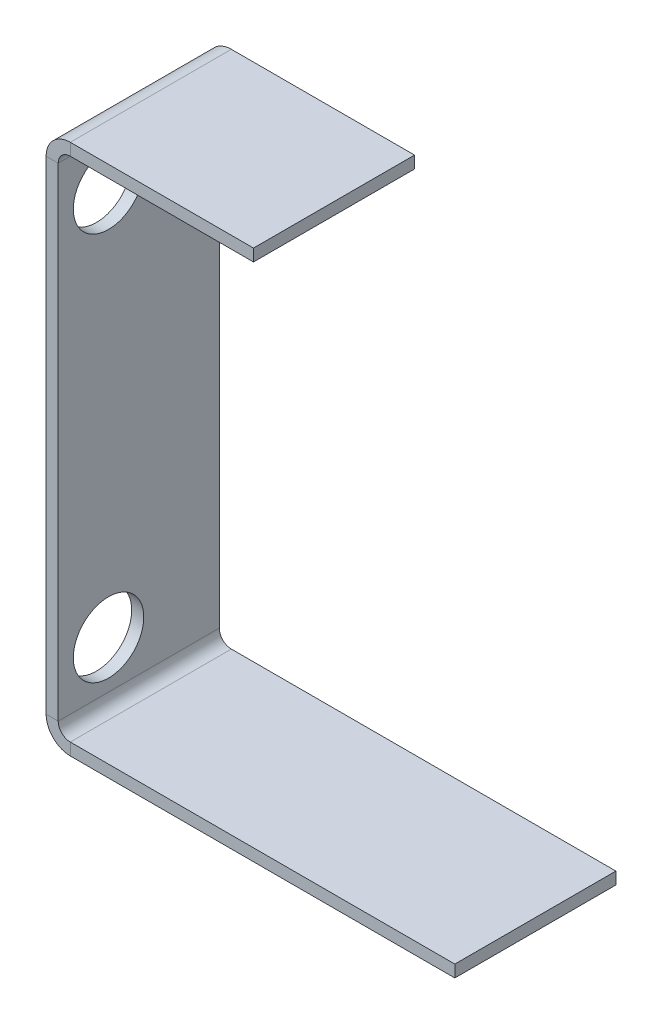
ISO-10303-21;
HEADER;
FILE_DESCRIPTION(('STEP AP214'),'2;1');
FILE_NAME('part.step','',(''),(''),'','','');
FILE_SCHEMA(('AUTOMOTIVE_DESIGN { 1 0 10303 214 1 1 1 1 }'));
ENDSEC;
DATA;
#1=APPLICATION_CONTEXT('core data for automotive mechanical design processes');
#2=APPLICATION_PROTOCOL_DEFINITION('international standard','automotive_design',2000,#1);
#3=PRODUCT_CONTEXT('',#1,'mechanical');
#4=PRODUCT('Part','Part','',(#3));
#5=PRODUCT_RELATED_PRODUCT_CATEGORY('part','',(#4));
#6=PRODUCT_DEFINITION_FORMATION('','',#4);
#7=PRODUCT_DEFINITION_CONTEXT('part definition',#1,'design');
#8=PRODUCT_DEFINITION('design','',#6,#7);
#9=PRODUCT_DEFINITION_SHAPE('','',#8);
#10=(LENGTH_UNIT() NAMED_UNIT(*) SI_UNIT(.MILLI.,.METRE.));
#11=(NAMED_UNIT(*) PLANE_ANGLE_UNIT() SI_UNIT($,.RADIAN.));
#12=(NAMED_UNIT(*) SI_UNIT($,.STERADIAN.) SOLID_ANGLE_UNIT());
#13=UNCERTAINTY_MEASURE_WITH_UNIT(LENGTH_MEASURE(1.E-05),#10,'distance_accuracy_value','');
#14=(GEOMETRIC_REPRESENTATION_CONTEXT(3) GLOBAL_UNCERTAINTY_ASSIGNED_CONTEXT((#13)) GLOBAL_UNIT_ASSIGNED_CONTEXT((#10,
#11,#12)) REPRESENTATION_CONTEXT('',''));
#15=CARTESIAN_POINT('',(0.,0.,0.));
#16=DIRECTION('',(0.,0.,1.));
#17=DIRECTION('',(1.,0.,0.));
#18=AXIS2_PLACEMENT_3D('',#15,#16,#17);
#19=CARTESIAN_POINT('',(0.,-6.,80.));
#20=DIRECTION('',(0.,0.,1.));
#21=DIRECTION('',(1.,0.,0.));
#22=AXIS2_PLACEMENT_3D('',#19,#20,#21);
#23=PLANE('',#22);
#24=DIRECTION('',(-1.,0.,0.));
#25=VECTOR('',#24,1.);
#26=CARTESIAN_POINT('',(0.,-6.,80.));
#27=LINE('',#26,#25);
#28=CARTESIAN_POINT('',(0.,-6.,80.));
#29=VERTEX_POINT('',#28);
#30=CARTESIAN_POINT('',(-6.,-6.,80.));
#31=VERTEX_POINT('',#30);
#32=EDGE_CURVE('E11',#29,#31,#27,.T.);
#33=ORIENTED_EDGE('',*,*,#32,.F.);
#34=CARTESIAN_POINT('',(6.,-6.,80.));
#35=DIRECTION('',(0.,0.,-1.));
#36=DIRECTION('',(-1.,0.,0.));
#37=AXIS2_PLACEMENT_3D('',#34,#35,#36);
#38=CIRCLE('',#37,6.);
#39=CARTESIAN_POINT('',(6.,0.,80.));
#40=VERTEX_POINT('',#39);
#41=EDGE_CURVE('E249',#40,#29,#38,.F.);
#42=ORIENTED_EDGE('',*,*,#41,.F.);
#43=DIRECTION('',(0.,-1.,0.));
#44=VECTOR('',#43,1.);
#45=CARTESIAN_POINT('',(5.99999999999999,6.,80.));
#46=LINE('',#45,#44);
#47=CARTESIAN_POINT('',(5.99999999999999,6.,80.));
#48=VERTEX_POINT('',#47);
#49=EDGE_CURVE('E46',#48,#40,#46,.T.);
#50=ORIENTED_EDGE('',*,*,#49,.F.);
#51=CARTESIAN_POINT('',(6.,-6.,80.));
#52=DIRECTION('',(0.,0.,1.));
#53=DIRECTION('',(1.,0.,0.));
#54=AXIS2_PLACEMENT_3D('',#51,#52,#53);
#55=CIRCLE('',#54,12.);
#56=EDGE_CURVE('E147',#48,#31,#55,.T.);
#57=ORIENTED_EDGE('',*,*,#56,.T.);
#58=EDGE_LOOP('',(#33,#42,#50,#57));
#59=FACE_BOUND('',#58,.T.);
#60=ADVANCED_FACE('F38',(#59),#23,.T.);
#61=CARTESIAN_POINT('',(5.99999999999999,6.,80.));
#62=DIRECTION('',(0.,0.,1.));
#63=DIRECTION('',(1.,0.,0.));
#64=AXIS2_PLACEMENT_3D('',#61,#62,#63);
#65=PLANE('',#64);
#66=DIRECTION('',(0.,-1.,0.));
#67=VECTOR('',#66,1.);
#68=CARTESIAN_POINT('',(0.,0.,80.));
#69=LINE('',#68,#67);
#70=CARTESIAN_POINT('',(0.,-246.,80.));
#71=VERTEX_POINT('',#70);
#72=EDGE_CURVE('E141',#29,#71,#69,.T.);
#73=ORIENTED_EDGE('',*,*,#72,.F.);
#74=ORIENTED_EDGE('',*,*,#32,.T.);
#75=DIRECTION('',(0.,-1.,0.));
#76=VECTOR('',#75,1.);
#77=CARTESIAN_POINT('',(-6.,0.,80.));
#78=LINE('',#77,#76);
#79=CARTESIAN_POINT('',(-5.99999999999997,-246.,80.));
#80=VERTEX_POINT('',#79);
#81=EDGE_CURVE('E138',#31,#80,#78,.T.);
#82=ORIENTED_EDGE('',*,*,#81,.T.);
#83=DIRECTION('',(1.,0.,0.));
#84=VECTOR('',#83,1.);
#85=CARTESIAN_POINT('',(-5.99999999999997,-246.,80.));
#86=LINE('',#85,#84);
#87=EDGE_CURVE('E230',#80,#71,#86,.T.);
#88=ORIENTED_EDGE('',*,*,#87,.T.);
#89=EDGE_LOOP('',(#73,#74,#82,#88));
#90=FACE_BOUND('',#89,.T.);
#91=ADVANCED_FACE('F136',(#90),#65,.T.);
#92=CARTESIAN_POINT('',(6.,0.,0.));
#93=DIRECTION('',(0.,0.,-1.));
#94=DIRECTION('',(-1.,0.,0.));
#95=AXIS2_PLACEMENT_3D('',#92,#93,#94);
#96=PLANE('',#95);
#97=DIRECTION('',(0.,1.,0.));
#98=VECTOR('',#97,1.);
#99=CARTESIAN_POINT('',(6.,0.,0.));
#100=LINE('',#99,#98);
#101=CARTESIAN_POINT('',(6.,0.,0.));
#102=VERTEX_POINT('',#101);
#103=CARTESIAN_POINT('',(5.99999999999999,6.,0.));
#104=VERTEX_POINT('',#103);
#105=EDGE_CURVE('E235',#102,#104,#100,.T.);
#106=ORIENTED_EDGE('',*,*,#105,.F.);
#107=CARTESIAN_POINT('',(6.,-6.,0.));
#108=DIRECTION('',(0.,0.,-1.));
#109=DIRECTION('',(-1.,0.,0.));
#110=AXIS2_PLACEMENT_3D('',#107,#108,#109);
#111=CIRCLE('',#110,6.);
#112=CARTESIAN_POINT('',(0.,-6.,0.));
#113=VERTEX_POINT('',#112);
#114=EDGE_CURVE('E187',#102,#113,#111,.F.);
#115=ORIENTED_EDGE('',*,*,#114,.T.);
#116=DIRECTION('',(1.,0.,0.));
#117=VECTOR('',#116,1.);
#118=CARTESIAN_POINT('',(-6.,-6.,0.));
#119=LINE('',#118,#117);
#120=CARTESIAN_POINT('',(-6.,-6.,0.));
#121=VERTEX_POINT('',#120);
#122=EDGE_CURVE('E233',#121,#113,#119,.T.);
#123=ORIENTED_EDGE('',*,*,#122,.F.);
#124=CARTESIAN_POINT('',(6.,-6.,0.));
#125=DIRECTION('',(0.,0.,1.));
#126=DIRECTION('',(1.,0.,0.));
#127=AXIS2_PLACEMENT_3D('',#124,#125,#126);
#128=CIRCLE('',#127,12.);
#129=EDGE_CURVE('E159',#104,#121,#128,.T.);
#130=ORIENTED_EDGE('',*,*,#129,.F.);
#131=EDGE_LOOP('',(#106,#115,#123,#130));
#132=FACE_BOUND('',#131,.T.);
#133=ADVANCED_FACE('F295',(#132),#96,.T.);
#134=CARTESIAN_POINT('',(-6.,-6.,0.));
#135=DIRECTION('',(0.,0.,-1.));
#136=DIRECTION('',(-1.,0.,0.));
#137=AXIS2_PLACEMENT_3D('',#134,#135,#136);
#138=PLANE('',#137);
#139=DIRECTION('',(-1.,0.,0.));
#140=VECTOR('',#139,1.);
#141=CARTESIAN_POINT('',(0.,0.,0.));
#142=LINE('',#141,#140);
#143=CARTESIAN_POINT('',(97.,0.,0.));
#144=VERTEX_POINT('',#143);
#145=EDGE_CURVE('E190',#144,#102,#142,.T.);
#146=ORIENTED_EDGE('',*,*,#145,.T.);
#147=ORIENTED_EDGE('',*,*,#105,.T.);
#148=DIRECTION('',(1.,0.,0.));
#149=VECTOR('',#148,1.);
#150=CARTESIAN_POINT('',(0.,6.,0.));
#151=LINE('',#150,#149);
#152=CARTESIAN_POINT('',(97.,6.,0.));
#153=VERTEX_POINT('',#152);
#154=EDGE_CURVE('E196',#153,#104,#151,.F.);
#155=ORIENTED_EDGE('',*,*,#154,.F.);
#156=DIRECTION('',(0.,-1.,0.));
#157=VECTOR('',#156,1.);
#158=CARTESIAN_POINT('',(97.,6.,0.));
#159=LINE('',#158,#157);
#160=EDGE_CURVE('E193',#153,#144,#159,.T.);
#161=ORIENTED_EDGE('',*,*,#160,.T.);
#162=EDGE_LOOP('',(#146,#147,#155,#161));
#163=FACE_BOUND('',#162,.T.);
#164=ADVANCED_FACE('F298',(#163),#138,.T.);
#165=CARTESIAN_POINT('',(6.00000000000003,-252.,80.));
#166=DIRECTION('',(0.,0.,1.));
#167=DIRECTION('',(1.,0.,0.));
#168=AXIS2_PLACEMENT_3D('',#165,#166,#167);
#169=PLANE('',#168);
#170=DIRECTION('',(0.,-1.,0.));
#171=VECTOR('',#170,1.);
#172=CARTESIAN_POINT('',(6.00000000000003,-252.,80.));
#173=LINE('',#172,#171);
#174=CARTESIAN_POINT('',(6.00000000000003,-252.,80.));
#175=VERTEX_POINT('',#174);
#176=CARTESIAN_POINT('',(6.00000000000003,-258.,80.));
#177=VERTEX_POINT('',#176);
#178=EDGE_CURVE('E54',#175,#177,#173,.T.);
#179=ORIENTED_EDGE('',*,*,#178,.F.);
#180=CARTESIAN_POINT('',(6.00000000000003,-246.,80.));
#181=DIRECTION('',(0.,0.,-1.));
#182=DIRECTION('',(-1.,0.,0.));
#183=AXIS2_PLACEMENT_3D('',#180,#181,#182);
#184=CIRCLE('',#183,6.);
#185=EDGE_CURVE('E259',#71,#175,#184,.F.);
#186=ORIENTED_EDGE('',*,*,#185,.F.);
#187=ORIENTED_EDGE('',*,*,#87,.F.);
#188=CARTESIAN_POINT('',(6.00000000000003,-246.,80.));
#189=DIRECTION('',(0.,0.,1.));
#190=DIRECTION('',(1.,0.,0.));
#191=AXIS2_PLACEMENT_3D('',#188,#189,#190);
#192=CIRCLE('',#191,12.);
#193=EDGE_CURVE('E167',#80,#177,#192,.T.);
#194=ORIENTED_EDGE('',*,*,#193,.T.);
#195=EDGE_LOOP('',(#179,#186,#187,#194));
#196=FACE_BOUND('',#195,.T.);
#197=ADVANCED_FACE('F323',(#196),#169,.T.);
#198=CARTESIAN_POINT('',(-5.99999999999997,-246.,80.));
#199=DIRECTION('',(0.,0.,1.));
#200=DIRECTION('',(1.,0.,0.));
#201=AXIS2_PLACEMENT_3D('',#198,#199,#200);
#202=PLANE('',#201);
#203=DIRECTION('',(1.,0.,0.));
#204=VECTOR('',#203,1.);
#205=CARTESIAN_POINT('',(0.,-252.,80.));
#206=LINE('',#205,#204);
#207=CARTESIAN_POINT('',(197.,-252.,80.));
#208=VERTEX_POINT('',#207);
#209=EDGE_CURVE('E262',#175,#208,#206,.T.);
#210=ORIENTED_EDGE('',*,*,#209,.F.);
#211=ORIENTED_EDGE('',*,*,#178,.T.);
#212=DIRECTION('',(1.,0.,0.));
#213=VECTOR('',#212,1.);
#214=CARTESIAN_POINT('',(0.,-258.,80.));
#215=LINE('',#214,#213);
#216=CARTESIAN_POINT('',(197.,-258.,80.));
#217=VERTEX_POINT('',#216);
#218=EDGE_CURVE('E108',#177,#217,#215,.T.);
#219=ORIENTED_EDGE('',*,*,#218,.T.);
#220=DIRECTION('',(0.,-1.,0.));
#221=VECTOR('',#220,1.);
#222=CARTESIAN_POINT('',(197.,-252.,80.));
#223=LINE('',#222,#221);
#224=EDGE_CURVE('E265',#208,#217,#223,.T.);
#225=ORIENTED_EDGE('',*,*,#224,.F.);
#226=EDGE_LOOP('',(#210,#211,#219,#225));
#227=FACE_BOUND('',#226,.T.);
#228=ADVANCED_FACE('F326',(#227),#202,.T.);
#229=CARTESIAN_POINT('',(0.,-246.,0.));
#230=DIRECTION('',(0.,0.,-1.));
#231=DIRECTION('',(-1.,0.,0.));
#232=AXIS2_PLACEMENT_3D('',#229,#230,#231);
#233=PLANE('',#232);
#234=DIRECTION('',(-1.,0.,0.));
#235=VECTOR('',#234,1.);
#236=CARTESIAN_POINT('',(0.,-246.,0.));
#237=LINE('',#236,#235);
#238=CARTESIAN_POINT('',(0.,-246.,0.));
#239=VERTEX_POINT('',#238);
#240=CARTESIAN_POINT('',(-5.99999999999997,-246.,0.));
#241=VERTEX_POINT('',#240);
#242=EDGE_CURVE('E95',#239,#241,#237,.T.);
#243=ORIENTED_EDGE('',*,*,#242,.F.);
#244=CARTESIAN_POINT('',(6.00000000000003,-246.,0.));
#245=DIRECTION('',(0.,0.,-1.));
#246=DIRECTION('',(-1.,0.,0.));
#247=AXIS2_PLACEMENT_3D('',#244,#245,#246);
#248=CIRCLE('',#247,6.);
#249=CARTESIAN_POINT('',(6.00000000000003,-252.,0.));
#250=VERTEX_POINT('',#249);
#251=EDGE_CURVE('E183',#239,#250,#248,.F.);
#252=ORIENTED_EDGE('',*,*,#251,.T.);
#253=DIRECTION('',(0.,1.,0.));
#254=VECTOR('',#253,1.);
#255=CARTESIAN_POINT('',(6.00000000000003,-258.,0.));
#256=LINE('',#255,#254);
#257=CARTESIAN_POINT('',(6.00000000000003,-258.,0.));
#258=VERTEX_POINT('',#257);
#259=EDGE_CURVE('E102',#258,#250,#256,.T.);
#260=ORIENTED_EDGE('',*,*,#259,.F.);
#261=CARTESIAN_POINT('',(6.00000000000003,-246.,0.));
#262=DIRECTION('',(0.,0.,1.));
#263=DIRECTION('',(1.,0.,0.));
#264=AXIS2_PLACEMENT_3D('',#261,#262,#263);
#265=CIRCLE('',#264,12.);
#266=EDGE_CURVE('E202',#241,#258,#265,.T.);
#267=ORIENTED_EDGE('',*,*,#266,.F.);
#268=EDGE_LOOP('',(#243,#252,#260,#267));
#269=FACE_BOUND('',#268,.T.);
#270=ADVANCED_FACE('F330',(#269),#233,.T.);
#271=CARTESIAN_POINT('',(6.00000000000003,-258.,0.));
#272=DIRECTION('',(0.,0.,-1.));
#273=DIRECTION('',(-1.,0.,0.));
#274=AXIS2_PLACEMENT_3D('',#271,#272,#273);
#275=PLANE('',#274);
#276=DIRECTION('',(0.,-1.,0.));
#277=VECTOR('',#276,1.);
#278=CARTESIAN_POINT('',(0.,0.,0.));
#279=LINE('',#278,#277);
#280=EDGE_CURVE('E185',#113,#239,#279,.T.);
#281=ORIENTED_EDGE('',*,*,#280,.T.);
#282=ORIENTED_EDGE('',*,*,#242,.T.);
#283=DIRECTION('',(0.,-1.,0.));
#284=VECTOR('',#283,1.);
#285=CARTESIAN_POINT('',(-6.,0.,0.));
#286=LINE('',#285,#284);
#287=EDGE_CURVE('E200',#121,#241,#286,.T.);
#288=ORIENTED_EDGE('',*,*,#287,.F.);
#289=ORIENTED_EDGE('',*,*,#122,.T.);
#290=EDGE_LOOP('',(#281,#282,#288,#289));
#291=FACE_BOUND('',#290,.T.);
#292=ADVANCED_FACE('F333',(#291),#275,.T.);
#293=CARTESIAN_POINT('',(0.,-258.,80.));
#294=DIRECTION('',(0.,1.,0.));
#295=DIRECTION('',(0.,0.,1.));
#296=AXIS2_PLACEMENT_3D('',#293,#294,#295);
#297=PLANE('',#296);
#298=DIRECTION('',(1.,0.,0.));
#299=VECTOR('',#298,1.);
#300=CARTESIAN_POINT('',(0.,-258.,0.));
#301=LINE('',#300,#299);
#302=CARTESIAN_POINT('',(197.,-258.,0.));
#303=VERTEX_POINT('',#302);
#304=EDGE_CURVE('E173',#258,#303,#301,.T.);
#305=ORIENTED_EDGE('',*,*,#304,.T.);
#306=DIRECTION('',(0.,0.,-1.));
#307=VECTOR('',#306,1.);
#308=CARTESIAN_POINT('',(197.,-258.,80.));
#309=LINE('',#308,#307);
#310=EDGE_CURVE('E226',#217,#303,#309,.T.);
#311=ORIENTED_EDGE('',*,*,#310,.F.);
#312=ORIENTED_EDGE('',*,*,#218,.F.);
#313=DIRECTION('',(0.,0.,-1.));
#314=VECTOR('',#313,1.);
#315=CARTESIAN_POINT('',(6.00000000000003,-258.,80.));
#316=LINE('',#315,#314);
#317=EDGE_CURVE('E169',#177,#258,#316,.T.);
#318=ORIENTED_EDGE('',*,*,#317,.T.);
#319=EDGE_LOOP('',(#305,#311,#312,#318));
#320=FACE_BOUND('',#319,.T.);
#321=ADVANCED_FACE('F336',(#320),#297,.F.);
#322=CARTESIAN_POINT('',(197.,-252.,80.));
#323=DIRECTION('',(1.,0.,0.));
#324=DIRECTION('',(0.,0.,-1.));
#325=AXIS2_PLACEMENT_3D('',#322,#323,#324);
#326=PLANE('',#325);
#327=DIRECTION('',(0.,-1.,0.));
#328=VECTOR('',#327,1.);
#329=CARTESIAN_POINT('',(197.,-252.,0.));
#330=LINE('',#329,#328);
#331=CARTESIAN_POINT('',(197.,-252.,0.));
#332=VERTEX_POINT('',#331);
#333=EDGE_CURVE('E176',#332,#303,#330,.T.);
#334=ORIENTED_EDGE('',*,*,#333,.F.);
#335=DIRECTION('',(0.,0.,-1.));
#336=VECTOR('',#335,1.);
#337=CARTESIAN_POINT('',(197.,-252.,80.));
#338=LINE('',#337,#336);
#339=EDGE_CURVE('E224',#208,#332,#338,.T.);
#340=ORIENTED_EDGE('',*,*,#339,.F.);
#341=ORIENTED_EDGE('',*,*,#224,.T.);
#342=ORIENTED_EDGE('',*,*,#310,.T.);
#343=EDGE_LOOP('',(#334,#340,#341,#342));
#344=FACE_BOUND('',#343,.T.);
#345=ADVANCED_FACE('F339',(#344),#326,.T.);
#346=CARTESIAN_POINT('',(0.,-252.,80.));
#347=DIRECTION('',(0.,1.,0.));
#348=DIRECTION('',(0.,0.,1.));
#349=AXIS2_PLACEMENT_3D('',#346,#347,#348);
#350=PLANE('',#349);
#351=DIRECTION('',(1.,0.,0.));
#352=VECTOR('',#351,1.);
#353=CARTESIAN_POINT('',(0.,-252.,0.));
#354=LINE('',#353,#352);
#355=EDGE_CURVE('E180',#250,#332,#354,.T.);
#356=ORIENTED_EDGE('',*,*,#355,.F.);
#357=DIRECTION('',(0.,0.,-1.));
#358=VECTOR('',#357,1.);
#359=CARTESIAN_POINT('',(6.00000000000003,-252.,80.));
#360=LINE('',#359,#358);
#361=EDGE_CURVE('E221',#175,#250,#360,.T.);
#362=ORIENTED_EDGE('',*,*,#361,.F.);
#363=ORIENTED_EDGE('',*,*,#209,.T.);
#364=ORIENTED_EDGE('',*,*,#339,.T.);
#365=EDGE_LOOP('',(#356,#362,#363,#364));
#366=FACE_BOUND('',#365,.T.);
#367=ADVANCED_FACE('F343',(#366),#350,.T.);
#368=CARTESIAN_POINT('',(6.00000000000003,-246.,80.));
#369=DIRECTION('',(0.,0.,-1.));
#370=DIRECTION('',(-1.,0.,0.));
#371=AXIS2_PLACEMENT_3D('',#368,#369,#370);
#372=CYLINDRICAL_SURFACE('',#371,6.);
#373=ORIENTED_EDGE('',*,*,#251,.F.);
#374=DIRECTION('',(0.,0.,-1.));
#375=VECTOR('',#374,1.);
#376=CARTESIAN_POINT('',(0.,-246.,80.));
#377=LINE('',#376,#375);
#378=EDGE_CURVE('E218',#71,#239,#377,.T.);
#379=ORIENTED_EDGE('',*,*,#378,.F.);
#380=ORIENTED_EDGE('',*,*,#185,.T.);
#381=ORIENTED_EDGE('',*,*,#361,.T.);
#382=EDGE_LOOP('',(#373,#379,#380,#381));
#383=FACE_BOUND('',#382,.T.);
#384=ADVANCED_FACE('F287',(#383),#372,.F.);
#385=CARTESIAN_POINT('',(0.,0.,80.));
#386=DIRECTION('',(1.,0.,0.));
#387=DIRECTION('',(0.,1.,0.));
#388=AXIS2_PLACEMENT_3D('',#385,#386,#387);
#389=PLANE('',#388);
#390=CARTESIAN_POINT('',(0.,-29.5,55.));
#391=DIRECTION('',(1.,0.,0.));
#392=DIRECTION('',(0.,1.,0.));
#393=AXIS2_PLACEMENT_3D('',#390,#391,#392);
#394=CIRCLE('',#393,17.5);
#395=CARTESIAN_POINT('',(0.,-12.,55.));
#396=VERTEX_POINT('',#395);
#397=EDGE_CURVE('E177',#396,#396,#394,.T.);
#398=ORIENTED_EDGE('',*,*,#397,.F.);
#399=EDGE_LOOP('',(#398));
#400=FACE_BOUND('',#399,.T.);
#401=CARTESIAN_POINT('',(0.,-222.5,55.));
#402=DIRECTION('',(1.,0.,0.));
#403=DIRECTION('',(0.,1.,0.));
#404=AXIS2_PLACEMENT_3D('',#401,#402,#403);
#405=CIRCLE('',#404,17.5);
#406=CARTESIAN_POINT('',(0.,-205.,55.));
#407=VERTEX_POINT('',#406);
#408=EDGE_CURVE('E272',#407,#407,#405,.T.);
#409=ORIENTED_EDGE('',*,*,#408,.F.);
#410=EDGE_LOOP('',(#409));
#411=FACE_BOUND('',#410,.T.);
#412=ORIENTED_EDGE('',*,*,#280,.F.);
#413=DIRECTION('',(0.,0.,-1.));
#414=VECTOR('',#413,1.);
#415=CARTESIAN_POINT('',(0.,-6.,80.));
#416=LINE('',#415,#414);
#417=EDGE_CURVE('E215',#29,#113,#416,.T.);
#418=ORIENTED_EDGE('',*,*,#417,.F.);
#419=ORIENTED_EDGE('',*,*,#72,.T.);
#420=ORIENTED_EDGE('',*,*,#378,.T.);
#421=EDGE_LOOP('',(#412,#418,#419,#420));
#422=FACE_BOUND('',#421,.T.);
#423=ADVANCED_FACE('F284',(#400,#411,#422),#389,.T.);
#424=CARTESIAN_POINT('',(6.,-6.,80.));
#425=DIRECTION('',(0.,0.,-1.));
#426=DIRECTION('',(-1.,0.,0.));
#427=AXIS2_PLACEMENT_3D('',#424,#425,#426);
#428=CYLINDRICAL_SURFACE('',#427,6.);
#429=ORIENTED_EDGE('',*,*,#114,.F.);
#430=DIRECTION('',(0.,0.,-1.));
#431=VECTOR('',#430,1.);
#432=CARTESIAN_POINT('',(6.,0.,80.));
#433=LINE('',#432,#431);
#434=EDGE_CURVE('E212',#40,#102,#433,.T.);
#435=ORIENTED_EDGE('',*,*,#434,.F.);
#436=ORIENTED_EDGE('',*,*,#41,.T.);
#437=ORIENTED_EDGE('',*,*,#417,.T.);
#438=EDGE_LOOP('',(#429,#435,#436,#437));
#439=FACE_BOUND('',#438,.T.);
#440=ADVANCED_FACE('F248',(#439),#428,.F.);
#441=CARTESIAN_POINT('',(0.,0.,80.));
#442=DIRECTION('',(0.,-1.,0.));
#443=DIRECTION('',(0.,0.,-1.));
#444=AXIS2_PLACEMENT_3D('',#441,#442,#443);
#445=PLANE('',#444);
#446=ORIENTED_EDGE('',*,*,#145,.F.);
#447=DIRECTION('',(0.,0.,-1.));
#448=VECTOR('',#447,1.);
#449=CARTESIAN_POINT('',(97.,0.,80.));
#450=LINE('',#449,#448);
#451=CARTESIAN_POINT('',(97.,0.,80.));
#452=VERTEX_POINT('',#451);
#453=EDGE_CURVE('E210',#452,#144,#450,.T.);
#454=ORIENTED_EDGE('',*,*,#453,.F.);
#455=DIRECTION('',(-1.,0.,0.));
#456=VECTOR('',#455,1.);
#457=CARTESIAN_POINT('',(0.,0.,80.));
#458=LINE('',#457,#456);
#459=EDGE_CURVE('E242',#452,#40,#458,.T.);
#460=ORIENTED_EDGE('',*,*,#459,.T.);
#461=ORIENTED_EDGE('',*,*,#434,.T.);
#462=EDGE_LOOP('',(#446,#454,#460,#461));
#463=FACE_BOUND('',#462,.T.);
#464=ADVANCED_FACE('F253',(#463),#445,.T.);
#465=CARTESIAN_POINT('',(97.,6.,80.));
#466=DIRECTION('',(1.,0.,0.));
#467=DIRECTION('',(0.,0.,-1.));
#468=AXIS2_PLACEMENT_3D('',#465,#466,#467);
#469=PLANE('',#468);
#470=ORIENTED_EDGE('',*,*,#160,.F.);
#471=DIRECTION('',(0.,0.,-1.));
#472=VECTOR('',#471,1.);
#473=CARTESIAN_POINT('',(97.,6.,80.));
#474=LINE('',#473,#472);
#475=CARTESIAN_POINT('',(97.,6.,80.));
#476=VERTEX_POINT('',#475);
#477=EDGE_CURVE('E208',#476,#153,#474,.T.);
#478=ORIENTED_EDGE('',*,*,#477,.F.);
#479=DIRECTION('',(0.,-1.,0.));
#480=VECTOR('',#479,1.);
#481=CARTESIAN_POINT('',(97.,6.,80.));
#482=LINE('',#481,#480);
#483=EDGE_CURVE('E254',#476,#452,#482,.T.);
#484=ORIENTED_EDGE('',*,*,#483,.T.);
#485=ORIENTED_EDGE('',*,*,#453,.T.);
#486=EDGE_LOOP('',(#470,#478,#484,#485));
#487=FACE_BOUND('',#486,.T.);
#488=ADVANCED_FACE('F303',(#487),#469,.T.);
#489=CARTESIAN_POINT('',(0.,6.,80.));
#490=DIRECTION('',(0.,-1.,0.));
#491=DIRECTION('',(0.,0.,-1.));
#492=AXIS2_PLACEMENT_3D('',#489,#490,#491);
#493=PLANE('',#492);
#494=ORIENTED_EDGE('',*,*,#154,.T.);
#495=DIRECTION('',(0.,0.,-1.));
#496=VECTOR('',#495,1.);
#497=CARTESIAN_POINT('',(5.99999999999999,6.,80.));
#498=LINE('',#497,#496);
#499=EDGE_CURVE('E161',#48,#104,#498,.T.);
#500=ORIENTED_EDGE('',*,*,#499,.F.);
#501=DIRECTION('',(1.,0.,0.));
#502=VECTOR('',#501,1.);
#503=CARTESIAN_POINT('',(0.,6.,80.));
#504=LINE('',#503,#502);
#505=EDGE_CURVE('E152',#476,#48,#504,.F.);
#506=ORIENTED_EDGE('',*,*,#505,.F.);
#507=ORIENTED_EDGE('',*,*,#477,.T.);
#508=EDGE_LOOP('',(#494,#500,#506,#507));
#509=FACE_BOUND('',#508,.T.);
#510=ADVANCED_FACE('F301',(#509),#493,.F.);
#511=CARTESIAN_POINT('',(6.,-6.,80.));
#512=DIRECTION('',(0.,0.,-1.));
#513=DIRECTION('',(-1.,0.,0.));
#514=AXIS2_PLACEMENT_3D('',#511,#512,#513);
#515=CYLINDRICAL_SURFACE('',#514,12.);
#516=ORIENTED_EDGE('',*,*,#129,.T.);
#517=DIRECTION('',(0.,0.,-1.));
#518=VECTOR('',#517,1.);
#519=CARTESIAN_POINT('',(-6.,-6.,80.));
#520=LINE('',#519,#518);
#521=EDGE_CURVE('E156',#31,#121,#520,.T.);
#522=ORIENTED_EDGE('',*,*,#521,.F.);
#523=ORIENTED_EDGE('',*,*,#56,.F.);
#524=ORIENTED_EDGE('',*,*,#499,.T.);
#525=EDGE_LOOP('',(#516,#522,#523,#524));
#526=FACE_BOUND('',#525,.T.);
#527=ADVANCED_FACE('F157',(#526),#515,.T.);
#528=CARTESIAN_POINT('',(-6.,0.,80.));
#529=DIRECTION('',(1.,0.,0.));
#530=DIRECTION('',(0.,1.,0.));
#531=AXIS2_PLACEMENT_3D('',#528,#529,#530);
#532=PLANE('',#531);
#533=CARTESIAN_POINT('',(-6.,-29.5,55.));
#534=DIRECTION('',(1.,0.,0.));
#535=DIRECTION('',(0.,1.,0.));
#536=AXIS2_PLACEMENT_3D('',#533,#534,#535);
#537=CIRCLE('',#536,17.5);
#538=CARTESIAN_POINT('',(-6.,-12.,55.));
#539=VERTEX_POINT('',#538);
#540=EDGE_CURVE('E275',#539,#539,#537,.T.);
#541=ORIENTED_EDGE('',*,*,#540,.T.);
#542=EDGE_LOOP('',(#541));
#543=FACE_BOUND('',#542,.T.);
#544=CARTESIAN_POINT('',(-5.99999999999998,-222.5,55.));
#545=DIRECTION('',(1.,0.,0.));
#546=DIRECTION('',(0.,1.,0.));
#547=AXIS2_PLACEMENT_3D('',#544,#545,#546);
#548=CIRCLE('',#547,17.5);
#549=CARTESIAN_POINT('',(-5.99999999999998,-205.,55.));
#550=VERTEX_POINT('',#549);
#551=EDGE_CURVE('E269',#550,#550,#548,.T.);
#552=ORIENTED_EDGE('',*,*,#551,.T.);
#553=EDGE_LOOP('',(#552));
#554=FACE_BOUND('',#553,.T.);
#555=ORIENTED_EDGE('',*,*,#287,.T.);
#556=DIRECTION('',(0.,0.,-1.));
#557=VECTOR('',#556,1.);
#558=CARTESIAN_POINT('',(-5.99999999999997,-246.,80.));
#559=LINE('',#558,#557);
#560=EDGE_CURVE('E162',#80,#241,#559,.T.);
#561=ORIENTED_EDGE('',*,*,#560,.F.);
#562=ORIENTED_EDGE('',*,*,#81,.F.);
#563=ORIENTED_EDGE('',*,*,#521,.T.);
#564=EDGE_LOOP('',(#555,#561,#562,#563));
#565=FACE_BOUND('',#564,.T.);
#566=ADVANCED_FACE('F164',(#543,#554,#565),#532,.F.);
#567=CARTESIAN_POINT('',(6.00000000000003,-246.,80.));
#568=DIRECTION('',(0.,0.,-1.));
#569=DIRECTION('',(-1.,0.,0.));
#570=AXIS2_PLACEMENT_3D('',#567,#568,#569);
#571=CYLINDRICAL_SURFACE('',#570,12.);
#572=ORIENTED_EDGE('',*,*,#266,.T.);
#573=ORIENTED_EDGE('',*,*,#317,.F.);
#574=ORIENTED_EDGE('',*,*,#193,.F.);
#575=ORIENTED_EDGE('',*,*,#560,.T.);
#576=EDGE_LOOP('',(#572,#573,#574,#575));
#577=FACE_BOUND('',#576,.T.);
#578=ADVANCED_FACE('F390',(#577),#571,.T.);
#579=CARTESIAN_POINT('',(6.00000000000003,-246.,80.));
#580=DIRECTION('',(0.,0.,-1.));
#581=DIRECTION('',(-1.,0.,0.));
#582=AXIS2_PLACEMENT_3D('',#579,#580,#581);
#583=PLANE('',#582);
#584=ORIENTED_EDGE('',*,*,#505,.T.);
#585=ORIENTED_EDGE('',*,*,#49,.T.);
#586=ORIENTED_EDGE('',*,*,#459,.F.);
#587=ORIENTED_EDGE('',*,*,#483,.F.);
#588=EDGE_LOOP('',(#584,#585,#586,#587));
#589=FACE_BOUND('',#588,.T.);
#590=ADVANCED_FACE('F239',(#589),#583,.F.);
#591=CARTESIAN_POINT('',(6.00000000000003,-246.,0.));
#592=DIRECTION('',(0.,0.,-1.));
#593=DIRECTION('',(-1.,0.,0.));
#594=AXIS2_PLACEMENT_3D('',#591,#592,#593);
#595=PLANE('',#594);
#596=ORIENTED_EDGE('',*,*,#304,.F.);
#597=ORIENTED_EDGE('',*,*,#259,.T.);
#598=ORIENTED_EDGE('',*,*,#355,.T.);
#599=ORIENTED_EDGE('',*,*,#333,.T.);
#600=EDGE_LOOP('',(#596,#597,#598,#599));
#601=FACE_BOUND('',#600,.T.);
#602=ADVANCED_FACE('F405',(#601),#595,.T.);
#603=CARTESIAN_POINT('',(0.,-222.5,55.));
#604=DIRECTION('',(-1.,0.,0.));
#605=DIRECTION('',(0.,-1.,0.));
#606=AXIS2_PLACEMENT_3D('',#603,#604,#605);
#607=CYLINDRICAL_SURFACE('',#606,17.5);
#608=ORIENTED_EDGE('',*,*,#408,.T.);
#609=EDGE_LOOP('',(#608));
#610=FACE_BOUND('',#609,.T.);
#611=ORIENTED_EDGE('',*,*,#551,.F.);
#612=EDGE_LOOP('',(#611));
#613=FACE_BOUND('',#612,.T.);
#614=ADVANCED_FACE('F414',(#610,#613),#607,.F.);
#615=CARTESIAN_POINT('',(0.,-29.5,55.));
#616=DIRECTION('',(-1.,0.,0.));
#617=DIRECTION('',(0.,-1.,0.));
#618=AXIS2_PLACEMENT_3D('',#615,#616,#617);
#619=CYLINDRICAL_SURFACE('',#618,17.5);
#620=ORIENTED_EDGE('',*,*,#397,.T.);
#621=EDGE_LOOP('',(#620));
#622=FACE_BOUND('',#621,.T.);
#623=ORIENTED_EDGE('',*,*,#540,.F.);
#624=EDGE_LOOP('',(#623));
#625=FACE_BOUND('',#624,.T.);
#626=ADVANCED_FACE('F281',(#622,#625),#619,.F.);
#627=CLOSED_SHELL('',(#60,#91,#133,#164,#197,#228,#270,#292,#321,#345,#367,#384,#423,#440,#464,
#488,#510,#527,#566,#578,#590,#602,#614,#626));
#628=MANIFOLD_SOLID_BREP('B2',#627);
#629=ADVANCED_BREP_SHAPE_REPRESENTATION('',(#18,#628),#14);
#630=SHAPE_DEFINITION_REPRESENTATION(#9,#629);
ENDSEC;
END-ISO-10303-21;
